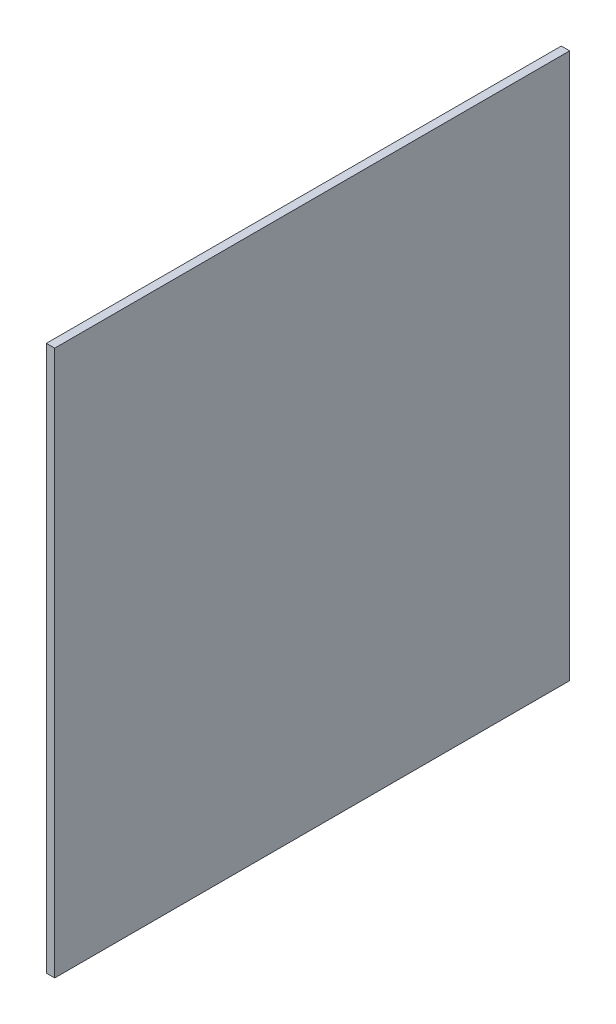
ISO-10303-21;
HEADER;
FILE_DESCRIPTION(('STEP AP214'),'2;1');
FILE_NAME('part.step','',(''),(''),'','','');
FILE_SCHEMA(('AUTOMOTIVE_DESIGN { 1 0 10303 214 1 1 1 1 }'));
ENDSEC;
DATA;
#1=APPLICATION_CONTEXT('core data for automotive mechanical design processes');
#2=APPLICATION_PROTOCOL_DEFINITION('international standard','automotive_design',2000,#1);
#3=PRODUCT_CONTEXT('',#1,'mechanical');
#4=PRODUCT('Part','Part','',(#3));
#5=PRODUCT_RELATED_PRODUCT_CATEGORY('part','',(#4));
#6=PRODUCT_DEFINITION_FORMATION('','',#4);
#7=PRODUCT_DEFINITION_CONTEXT('part definition',#1,'design');
#8=PRODUCT_DEFINITION('design','',#6,#7);
#9=PRODUCT_DEFINITION_SHAPE('','',#8);
#10=(LENGTH_UNIT() NAMED_UNIT(*) SI_UNIT(.MILLI.,.METRE.));
#11=(NAMED_UNIT(*) PLANE_ANGLE_UNIT() SI_UNIT($,.RADIAN.));
#12=(NAMED_UNIT(*) SI_UNIT($,.STERADIAN.) SOLID_ANGLE_UNIT());
#13=UNCERTAINTY_MEASURE_WITH_UNIT(LENGTH_MEASURE(1.E-05),#10,'distance_accuracy_value','');
#14=(GEOMETRIC_REPRESENTATION_CONTEXT(3) GLOBAL_UNCERTAINTY_ASSIGNED_CONTEXT((#13)) GLOBAL_UNIT_ASSIGNED_CONTEXT((#10,
#11,#12)) REPRESENTATION_CONTEXT('',''));
#15=CARTESIAN_POINT('',(0.,0.,0.));
#16=DIRECTION('',(0.,0.,1.));
#17=DIRECTION('',(1.,0.,0.));
#18=AXIS2_PLACEMENT_3D('',#15,#16,#17);
#19=CARTESIAN_POINT('',(4.,0.,188.387137967299));
#20=DIRECTION('',(0.,0.,-1.));
#21=DIRECTION('',(-1.,0.,0.));
#22=AXIS2_PLACEMENT_3D('',#19,#20,#21);
#23=PLANE('',#22);
#24=DIRECTION('',(0.,-1.,0.));
#25=VECTOR('',#24,1.);
#26=CARTESIAN_POINT('',(0.,0.,188.387137967299));
#27=LINE('',#26,#25);
#28=CARTESIAN_POINT('',(0.,0.,188.387137967299));
#29=VERTEX_POINT('',#28);
#30=CARTESIAN_POINT('',(0.,-260.901962247545,188.387137967299));
#31=VERTEX_POINT('',#30);
#32=EDGE_CURVE('E94',#29,#31,#27,.T.);
#33=ORIENTED_EDGE('',*,*,#32,.T.);
#34=DIRECTION('',(-1.,0.,0.));
#35=VECTOR('',#34,1.);
#36=CARTESIAN_POINT('',(4.,-260.901962247545,188.387137967299));
#37=LINE('',#36,#35);
#38=CARTESIAN_POINT('',(4.,-260.901962247545,188.387137967299));
#39=VERTEX_POINT('',#38);
#40=EDGE_CURVE('E11',#39,#31,#37,.T.);
#41=ORIENTED_EDGE('',*,*,#40,.F.);
#42=DIRECTION('',(0.,-1.,0.));
#43=VECTOR('',#42,1.);
#44=CARTESIAN_POINT('',(4.,0.,188.387137967299));
#45=LINE('',#44,#43);
#46=CARTESIAN_POINT('',(4.,0.,188.387137967299));
#47=VERTEX_POINT('',#46);
#48=EDGE_CURVE('E82',#47,#39,#45,.T.);
#49=ORIENTED_EDGE('',*,*,#48,.F.);
#50=DIRECTION('',(-1.,0.,0.));
#51=VECTOR('',#50,1.);
#52=CARTESIAN_POINT('',(4.,0.,188.387137967299));
#53=LINE('',#52,#51);
#54=EDGE_CURVE('E90',#47,#29,#53,.T.);
#55=ORIENTED_EDGE('',*,*,#54,.T.);
#56=EDGE_LOOP('',(#33,#41,#49,#55));
#57=FACE_BOUND('',#56,.T.);
#58=ADVANCED_FACE('F31',(#57),#23,.F.);
#59=CARTESIAN_POINT('',(4.,-260.901962247545,188.387137967299));
#60=DIRECTION('',(0.,1.,0.));
#61=DIRECTION('',(0.,0.,1.));
#62=AXIS2_PLACEMENT_3D('',#59,#60,#61);
#63=PLANE('',#62);
#64=DIRECTION('',(0.,0.,-1.));
#65=VECTOR('',#64,1.);
#66=CARTESIAN_POINT('',(0.,-260.901962247545,188.387137967299));
#67=LINE('',#66,#65);
#68=CARTESIAN_POINT('',(0.,-260.901962247545,-57.9264727940615));
#69=VERTEX_POINT('',#68);
#70=EDGE_CURVE('E86',#31,#69,#67,.T.);
#71=ORIENTED_EDGE('',*,*,#70,.T.);
#72=DIRECTION('',(-1.,0.,0.));
#73=VECTOR('',#72,1.);
#74=CARTESIAN_POINT('',(4.,-260.901962247545,-57.9264727940615));
#75=LINE('',#74,#73);
#76=CARTESIAN_POINT('',(4.,-260.901962247545,-57.9264727940615));
#77=VERTEX_POINT('',#76);
#78=EDGE_CURVE('E39',#77,#69,#75,.T.);
#79=ORIENTED_EDGE('',*,*,#78,.F.);
#80=DIRECTION('',(0.,0.,-1.));
#81=VECTOR('',#80,1.);
#82=CARTESIAN_POINT('',(4.,-260.901962247545,188.387137967299));
#83=LINE('',#82,#81);
#84=EDGE_CURVE('E77',#39,#77,#83,.T.);
#85=ORIENTED_EDGE('',*,*,#84,.F.);
#86=ORIENTED_EDGE('',*,*,#40,.T.);
#87=EDGE_LOOP('',(#71,#79,#85,#86));
#88=FACE_BOUND('',#87,.T.);
#89=ADVANCED_FACE('F85',(#88),#63,.F.);
#90=CARTESIAN_POINT('',(4.,0.,-57.9264727940615));
#91=DIRECTION('',(0.,0.,1.));
#92=DIRECTION('',(1.,0.,0.));
#93=AXIS2_PLACEMENT_3D('',#90,#91,#92);
#94=PLANE('',#93);
#95=DIRECTION('',(0.,1.,0.));
#96=VECTOR('',#95,1.);
#97=CARTESIAN_POINT('',(0.,0.,-57.9264727940615));
#98=LINE('',#97,#96);
#99=CARTESIAN_POINT('',(0.,0.,-57.9264727940615));
#100=VERTEX_POINT('',#99);
#101=EDGE_CURVE('E64',#69,#100,#98,.T.);
#102=ORIENTED_EDGE('',*,*,#101,.T.);
#103=DIRECTION('',(-1.,0.,0.));
#104=VECTOR('',#103,1.);
#105=CARTESIAN_POINT('',(4.,0.,-57.9264727940615));
#106=LINE('',#105,#104);
#107=CARTESIAN_POINT('',(4.,0.,-57.9264727940615));
#108=VERTEX_POINT('',#107);
#109=EDGE_CURVE('E87',#108,#100,#106,.T.);
#110=ORIENTED_EDGE('',*,*,#109,.F.);
#111=DIRECTION('',(0.,1.,0.));
#112=VECTOR('',#111,1.);
#113=CARTESIAN_POINT('',(4.,0.,-57.9264727940615));
#114=LINE('',#113,#112);
#115=EDGE_CURVE('E80',#77,#108,#114,.T.);
#116=ORIENTED_EDGE('',*,*,#115,.F.);
#117=ORIENTED_EDGE('',*,*,#78,.T.);
#118=EDGE_LOOP('',(#102,#110,#116,#117));
#119=FACE_BOUND('',#118,.T.);
#120=ADVANCED_FACE('F88',(#119),#94,.F.);
#121=CARTESIAN_POINT('',(4.,0.,188.387137967299));
#122=DIRECTION('',(0.,-1.,0.));
#123=DIRECTION('',(0.,0.,-1.));
#124=AXIS2_PLACEMENT_3D('',#121,#122,#123);
#125=PLANE('',#124);
#126=DIRECTION('',(0.,0.,1.));
#127=VECTOR('',#126,1.);
#128=CARTESIAN_POINT('',(0.,0.,188.387137967299));
#129=LINE('',#128,#127);
#130=EDGE_CURVE('E70',#100,#29,#129,.T.);
#131=ORIENTED_EDGE('',*,*,#130,.T.);
#132=ORIENTED_EDGE('',*,*,#54,.F.);
#133=DIRECTION('',(0.,0.,1.));
#134=VECTOR('',#133,1.);
#135=CARTESIAN_POINT('',(4.,0.,188.387137967299));
#136=LINE('',#135,#134);
#137=EDGE_CURVE('E47',#108,#47,#136,.T.);
#138=ORIENTED_EDGE('',*,*,#137,.F.);
#139=ORIENTED_EDGE('',*,*,#109,.T.);
#140=EDGE_LOOP('',(#131,#132,#138,#139));
#141=FACE_BOUND('',#140,.T.);
#142=ADVANCED_FACE('F101',(#141),#125,.F.);
#143=CARTESIAN_POINT('',(4.,-260.901962247545,188.387137967299));
#144=DIRECTION('',(1.,0.,0.));
#145=DIRECTION('',(0.,0.,-1.));
#146=AXIS2_PLACEMENT_3D('',#143,#144,#145);
#147=PLANE('',#146);
#148=ORIENTED_EDGE('',*,*,#48,.T.);
#149=ORIENTED_EDGE('',*,*,#84,.T.);
#150=ORIENTED_EDGE('',*,*,#115,.T.);
#151=ORIENTED_EDGE('',*,*,#137,.T.);
#152=EDGE_LOOP('',(#148,#149,#150,#151));
#153=FACE_BOUND('',#152,.T.);
#154=ADVANCED_FACE('F78',(#153),#147,.T.);
#155=CARTESIAN_POINT('',(0.,-260.901962247545,188.387137967299));
#156=DIRECTION('',(1.,0.,0.));
#157=DIRECTION('',(0.,0.,-1.));
#158=AXIS2_PLACEMENT_3D('',#155,#156,#157);
#159=PLANE('',#158);
#160=ORIENTED_EDGE('',*,*,#32,.F.);
#161=ORIENTED_EDGE('',*,*,#130,.F.);
#162=ORIENTED_EDGE('',*,*,#101,.F.);
#163=ORIENTED_EDGE('',*,*,#70,.F.);
#164=EDGE_LOOP('',(#160,#161,#162,#163));
#165=FACE_BOUND('',#164,.T.);
#166=ADVANCED_FACE('F104',(#165),#159,.F.);
#167=CLOSED_SHELL('',(#58,#89,#120,#142,#154,#166));
#168=MANIFOLD_SOLID_BREP('B2',#167);
#169=ADVANCED_BREP_SHAPE_REPRESENTATION('',(#18,#168),#14);
#170=SHAPE_DEFINITION_REPRESENTATION(#9,#169);
ENDSEC;
END-ISO-10303-21;
